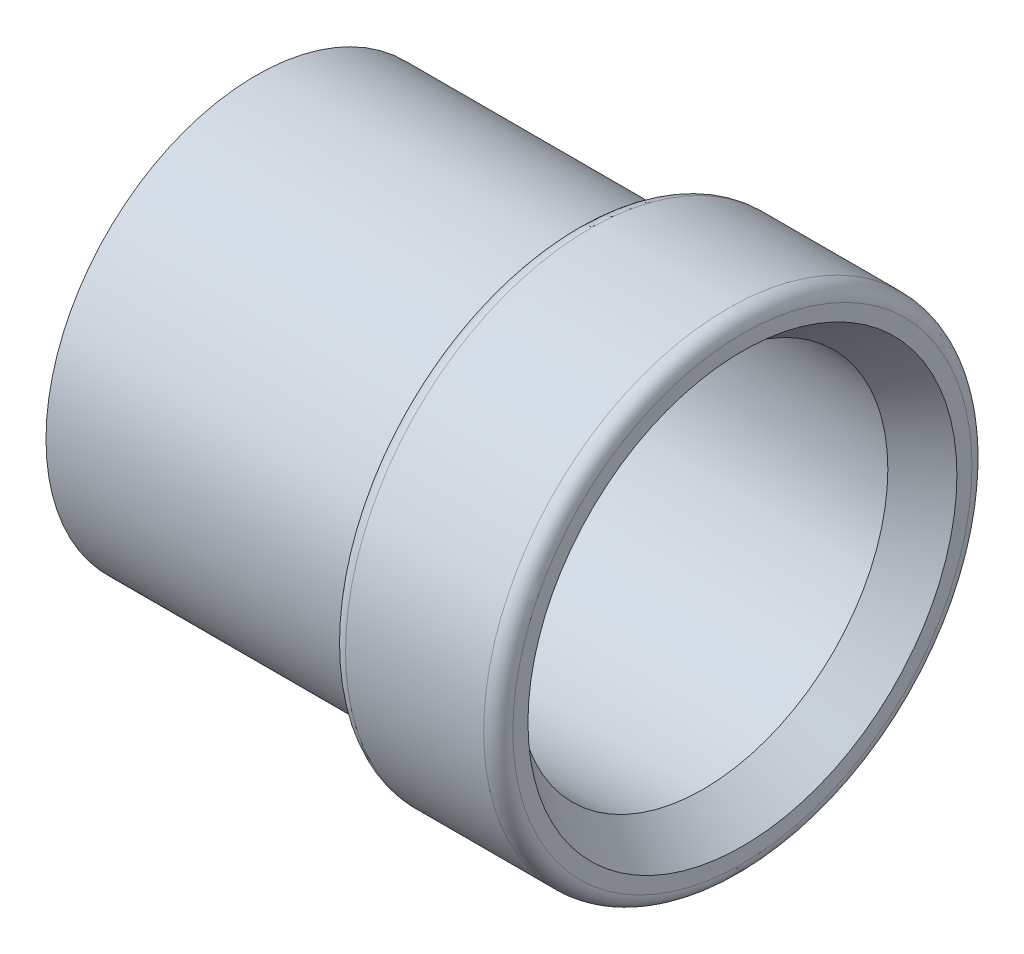
ISO-10303-21;
HEADER;
FILE_DESCRIPTION(('STEP AP214'),'2;1');
FILE_NAME('part.step','',(''),(''),'','','');
FILE_SCHEMA(('AUTOMOTIVE_DESIGN { 1 0 10303 214 1 1 1 1 }'));
ENDSEC;
DATA;
#1=APPLICATION_CONTEXT('core data for automotive mechanical design processes');
#2=APPLICATION_PROTOCOL_DEFINITION('international standard','automotive_design',2000,#1);
#3=PRODUCT_CONTEXT('',#1,'mechanical');
#4=PRODUCT('Part','Part','',(#3));
#5=PRODUCT_RELATED_PRODUCT_CATEGORY('part','',(#4));
#6=PRODUCT_DEFINITION_FORMATION('','',#4);
#7=PRODUCT_DEFINITION_CONTEXT('part definition',#1,'design');
#8=PRODUCT_DEFINITION('design','',#6,#7);
#9=PRODUCT_DEFINITION_SHAPE('','',#8);
#10=(LENGTH_UNIT() NAMED_UNIT(*) SI_UNIT(.MILLI.,.METRE.));
#11=(NAMED_UNIT(*) PLANE_ANGLE_UNIT() SI_UNIT($,.RADIAN.));
#12=(NAMED_UNIT(*) SI_UNIT($,.STERADIAN.) SOLID_ANGLE_UNIT());
#13=UNCERTAINTY_MEASURE_WITH_UNIT(LENGTH_MEASURE(1.E-05),#10,'distance_accuracy_value','');
#14=(GEOMETRIC_REPRESENTATION_CONTEXT(3) GLOBAL_UNCERTAINTY_ASSIGNED_CONTEXT((#13)) GLOBAL_UNIT_ASSIGNED_CONTEXT((#10,
#11,#12)) REPRESENTATION_CONTEXT('',''));
#15=CARTESIAN_POINT('',(0.,0.,0.));
#16=DIRECTION('',(0.,0.,1.));
#17=DIRECTION('',(1.,0.,0.));
#18=AXIS2_PLACEMENT_3D('',#15,#16,#17);
#19=CARTESIAN_POINT('',(-6.35,4.826,0.));
#20=DIRECTION('',(1.,0.,0.));
#21=DIRECTION('',(0.,0.,-1.));
#22=AXIS2_PLACEMENT_3D('',#19,#20,#21);
#23=PLANE('',#22);
#24=CARTESIAN_POINT('',(-6.35,0.,0.));
#25=DIRECTION('',(-1.,0.,0.));
#26=DIRECTION('',(0.,0.,1.));
#27=AXIS2_PLACEMENT_3D('',#24,#25,#26);
#28=CIRCLE('',#27,4.826);
#29=CARTESIAN_POINT('',(-6.35,0.,4.826));
#30=VERTEX_POINT('',#29);
#31=EDGE_CURVE('E10',#30,#30,#28,.T.);
#32=ORIENTED_EDGE('',*,*,#31,.F.);
#33=EDGE_LOOP('',(#32));
#34=FACE_BOUND('',#33,.T.);
#35=CARTESIAN_POINT('',(-6.35,0.,0.));
#36=DIRECTION('',(-1.,0.,0.));
#37=DIRECTION('',(0.,0.,1.));
#38=AXIS2_PLACEMENT_3D('',#35,#36,#37);
#39=CIRCLE('',#38,5.4864);
#40=CARTESIAN_POINT('',(-6.35,0.,5.4864));
#41=VERTEX_POINT('',#40);
#42=EDGE_CURVE('E66',#41,#41,#39,.T.);
#43=ORIENTED_EDGE('',*,*,#42,.T.);
#44=EDGE_LOOP('',(#43));
#45=FACE_BOUND('',#44,.T.);
#46=ADVANCED_FACE('F35',(#34,#45),#23,.F.);
#47=CARTESIAN_POINT('',(-6.35,0.,0.));
#48=DIRECTION('',(-1.,0.,0.));
#49=DIRECTION('',(0.,0.,1.));
#50=AXIS2_PLACEMENT_3D('',#47,#48,#49);
#51=CYLINDRICAL_SURFACE('',#50,4.826);
#52=CARTESIAN_POINT('',(5.32193837669067,0.,0.));
#53=DIRECTION('',(-1.,0.,0.));
#54=DIRECTION('',(0.,0.,1.));
#55=AXIS2_PLACEMENT_3D('',#52,#53,#54);
#56=CIRCLE('',#55,4.826);
#57=CARTESIAN_POINT('',(5.32193837669067,0.,4.826));
#58=VERTEX_POINT('',#57);
#59=EDGE_CURVE('E41',#58,#58,#56,.T.);
#60=ORIENTED_EDGE('',*,*,#59,.F.);
#61=EDGE_LOOP('',(#60));
#62=FACE_BOUND('',#61,.T.);
#63=ORIENTED_EDGE('',*,*,#31,.T.);
#64=EDGE_LOOP('',(#63));
#65=FACE_BOUND('',#64,.T.);
#66=ADVANCED_FACE('F109',(#62,#65),#51,.F.);
#67=CARTESIAN_POINT('',(5.32193837669067,0.,0.));
#68=DIRECTION('',(1.,0.,0.));
#69=DIRECTION('',(0.,0.,-1.));
#70=AXIS2_PLACEMENT_3D('',#67,#68,#69);
#71=CONICAL_SURFACE('',#70,4.826,0.645771823237903);
#72=CARTESIAN_POINT('',(6.35,0.,0.));
#73=DIRECTION('',(-1.,0.,0.));
#74=DIRECTION('',(0.,0.,1.));
#75=AXIS2_PLACEMENT_3D('',#72,#73,#74);
#76=CIRCLE('',#75,5.6007);
#77=CARTESIAN_POINT('',(6.35,0.,5.6007));
#78=VERTEX_POINT('',#77);
#79=EDGE_CURVE('E45',#78,#78,#76,.T.);
#80=ORIENTED_EDGE('',*,*,#79,.F.);
#81=EDGE_LOOP('',(#80));
#82=FACE_BOUND('',#81,.T.);
#83=ORIENTED_EDGE('',*,*,#59,.T.);
#84=EDGE_LOOP('',(#83));
#85=FACE_BOUND('',#84,.T.);
#86=ADVANCED_FACE('F104',(#82,#85),#71,.F.);
#87=CARTESIAN_POINT('',(6.35,5.6007,0.));
#88=DIRECTION('',(-1.,0.,0.));
#89=DIRECTION('',(0.,0.,1.));
#90=AXIS2_PLACEMENT_3D('',#87,#88,#89);
#91=PLANE('',#90);
#92=CARTESIAN_POINT('',(6.35,0.,0.));
#93=DIRECTION('',(-1.,0.,0.));
#94=DIRECTION('',(0.,0.,1.));
#95=AXIS2_PLACEMENT_3D('',#92,#93,#94);
#96=CIRCLE('',#95,5.9944);
#97=CARTESIAN_POINT('',(6.35,0.,5.9944));
#98=VERTEX_POINT('',#97);
#99=EDGE_CURVE('E49',#98,#98,#96,.T.);
#100=ORIENTED_EDGE('',*,*,#99,.F.);
#101=EDGE_LOOP('',(#100));
#102=FACE_BOUND('',#101,.T.);
#103=ORIENTED_EDGE('',*,*,#79,.T.);
#104=EDGE_LOOP('',(#103));
#105=FACE_BOUND('',#104,.T.);
#106=ADVANCED_FACE('F98',(#102,#105),#91,.F.);
#107=CARTESIAN_POINT('',(5.969,0.,0.));
#108=DIRECTION('',(-1.,0.,0.));
#109=DIRECTION('',(0.,0.,1.));
#110=AXIS2_PLACEMENT_3D('',#107,#108,#109);
#111=TOROIDAL_SURFACE('',#110,5.9944,0.381);
#112=CARTESIAN_POINT('',(5.969,0.,0.));
#113=DIRECTION('',(-1.,0.,0.));
#114=DIRECTION('',(0.,0.,1.));
#115=AXIS2_PLACEMENT_3D('',#112,#113,#114);
#116=CIRCLE('',#115,6.3754);
#117=CARTESIAN_POINT('',(5.969,0.,6.3754));
#118=VERTEX_POINT('',#117);
#119=EDGE_CURVE('E54',#118,#118,#116,.T.);
#120=ORIENTED_EDGE('',*,*,#119,.F.);
#121=EDGE_LOOP('',(#120));
#122=FACE_BOUND('',#121,.T.);
#123=ORIENTED_EDGE('',*,*,#99,.T.);
#124=EDGE_LOOP('',(#123));
#125=FACE_BOUND('',#124,.T.);
#126=ADVANCED_FACE('F92',(#122,#125),#111,.T.);
#127=CARTESIAN_POINT('',(-6.35,0.,0.));
#128=DIRECTION('',(-1.,0.,0.));
#129=DIRECTION('',(0.,0.,1.));
#130=AXIS2_PLACEMENT_3D('',#127,#128,#129);
#131=CYLINDRICAL_SURFACE('',#130,6.3754);
#132=CARTESIAN_POINT('',(2.3622,0.,0.));
#133=DIRECTION('',(-1.,0.,0.));
#134=DIRECTION('',(0.,0.,1.));
#135=AXIS2_PLACEMENT_3D('',#132,#133,#134);
#136=CIRCLE('',#135,6.3754);
#137=CARTESIAN_POINT('',(2.3622,0.,6.3754));
#138=VERTEX_POINT('',#137);
#139=EDGE_CURVE('E57',#138,#138,#136,.T.);
#140=ORIENTED_EDGE('',*,*,#139,.F.);
#141=EDGE_LOOP('',(#140));
#142=FACE_BOUND('',#141,.T.);
#143=ORIENTED_EDGE('',*,*,#119,.T.);
#144=EDGE_LOOP('',(#143));
#145=FACE_BOUND('',#144,.T.);
#146=ADVANCED_FACE('F86',(#142,#145),#131,.T.);
#147=CARTESIAN_POINT('',(2.3622,0.,0.));
#148=DIRECTION('',(-1.,0.,0.));
#149=DIRECTION('',(0.,0.,1.));
#150=AXIS2_PLACEMENT_3D('',#147,#148,#149);
#151=TOROIDAL_SURFACE('',#150,5.9944,0.381000000000001);
#152=CARTESIAN_POINT('',(1.9812,0.,0.));
#153=DIRECTION('',(-1.,0.,0.));
#154=DIRECTION('',(0.,0.,1.));
#155=AXIS2_PLACEMENT_3D('',#152,#153,#154);
#156=CIRCLE('',#155,5.9944);
#157=CARTESIAN_POINT('',(1.9812,0.,5.9944));
#158=VERTEX_POINT('',#157);
#159=EDGE_CURVE('E60',#158,#158,#156,.T.);
#160=ORIENTED_EDGE('',*,*,#159,.F.);
#161=EDGE_LOOP('',(#160));
#162=FACE_BOUND('',#161,.T.);
#163=ORIENTED_EDGE('',*,*,#139,.T.);
#164=EDGE_LOOP('',(#163));
#165=FACE_BOUND('',#164,.T.);
#166=ADVANCED_FACE('F80',(#162,#165),#151,.T.);
#167=CARTESIAN_POINT('',(1.9812,5.9944,0.));
#168=DIRECTION('',(1.,0.,0.));
#169=DIRECTION('',(0.,0.,-1.));
#170=AXIS2_PLACEMENT_3D('',#167,#168,#169);
#171=PLANE('',#170);
#172=CARTESIAN_POINT('',(1.9812,0.,0.));
#173=DIRECTION('',(-1.,0.,0.));
#174=DIRECTION('',(0.,0.,1.));
#175=AXIS2_PLACEMENT_3D('',#172,#173,#174);
#176=CIRCLE('',#175,5.4864);
#177=CARTESIAN_POINT('',(1.9812,0.,5.4864));
#178=VERTEX_POINT('',#177);
#179=EDGE_CURVE('E63',#178,#178,#176,.T.);
#180=ORIENTED_EDGE('',*,*,#179,.F.);
#181=EDGE_LOOP('',(#180));
#182=FACE_BOUND('',#181,.T.);
#183=ORIENTED_EDGE('',*,*,#159,.T.);
#184=EDGE_LOOP('',(#183));
#185=FACE_BOUND('',#184,.T.);
#186=ADVANCED_FACE('F74',(#182,#185),#171,.F.);
#187=CARTESIAN_POINT('',(-6.35,0.,0.));
#188=DIRECTION('',(-1.,0.,0.));
#189=DIRECTION('',(0.,0.,1.));
#190=AXIS2_PLACEMENT_3D('',#187,#188,#189);
#191=CYLINDRICAL_SURFACE('',#190,5.4864);
#192=ORIENTED_EDGE('',*,*,#42,.F.);
#193=EDGE_LOOP('',(#192));
#194=FACE_BOUND('',#193,.T.);
#195=ORIENTED_EDGE('',*,*,#179,.T.);
#196=EDGE_LOOP('',(#195));
#197=FACE_BOUND('',#196,.T.);
#198=ADVANCED_FACE('F71',(#194,#197),#191,.T.);
#199=CLOSED_SHELL('',(#46,#66,#86,#106,#126,#146,#166,#186,#198));
#200=MANIFOLD_SOLID_BREP('B2',#199);
#201=ADVANCED_BREP_SHAPE_REPRESENTATION('',(#18,#200),#14);
#202=SHAPE_DEFINITION_REPRESENTATION(#9,#201);
ENDSEC;
END-ISO-10303-21;
